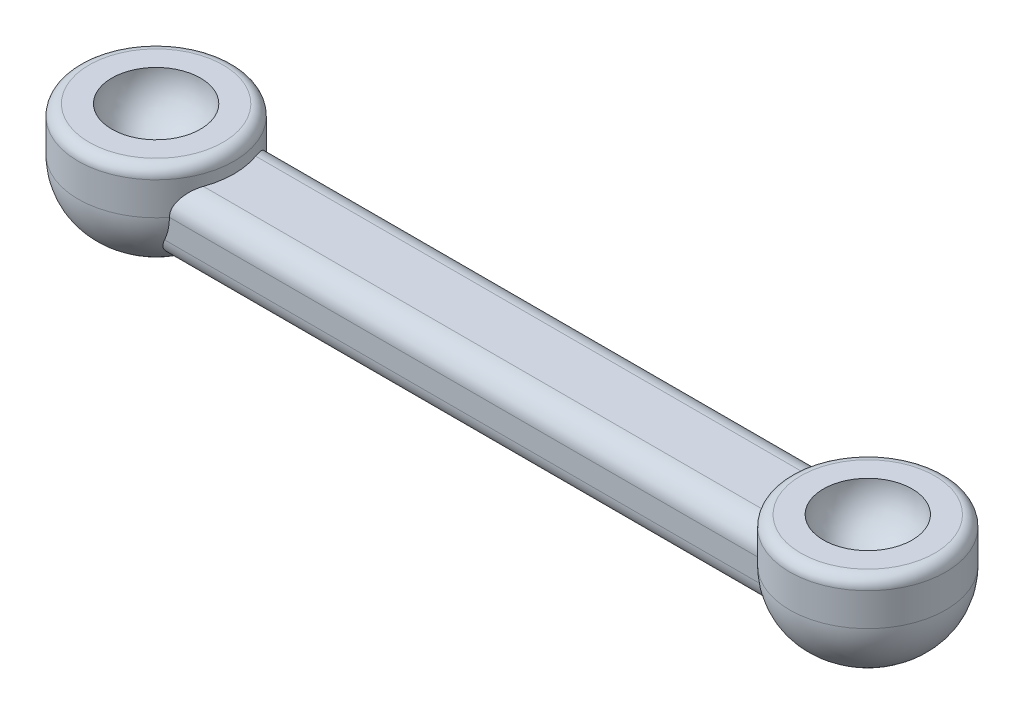
ISO-10303-21;
HEADER;
FILE_DESCRIPTION(('STEP AP214'),'2;1');
FILE_NAME('part.step','',(''),(''),'','','');
FILE_SCHEMA(('AUTOMOTIVE_DESIGN { 1 0 10303 214 1 1 1 1 }'));
ENDSEC;
DATA;
#1=APPLICATION_CONTEXT('core data for automotive mechanical design processes');
#2=APPLICATION_PROTOCOL_DEFINITION('international standard','automotive_design',2000,#1);
#3=PRODUCT_CONTEXT('',#1,'mechanical');
#4=PRODUCT('Part','Part','',(#3));
#5=PRODUCT_RELATED_PRODUCT_CATEGORY('part','',(#4));
#6=PRODUCT_DEFINITION_FORMATION('','',#4);
#7=PRODUCT_DEFINITION_CONTEXT('part definition',#1,'design');
#8=PRODUCT_DEFINITION('design','',#6,#7);
#9=PRODUCT_DEFINITION_SHAPE('','',#8);
#10=(LENGTH_UNIT() NAMED_UNIT(*) SI_UNIT(.MILLI.,.METRE.));
#11=(NAMED_UNIT(*) PLANE_ANGLE_UNIT() SI_UNIT($,.RADIAN.));
#12=(NAMED_UNIT(*) SI_UNIT($,.STERADIAN.) SOLID_ANGLE_UNIT());
#13=UNCERTAINTY_MEASURE_WITH_UNIT(LENGTH_MEASURE(1.E-05),#10,'distance_accuracy_value','');
#14=(GEOMETRIC_REPRESENTATION_CONTEXT(3) GLOBAL_UNCERTAINTY_ASSIGNED_CONTEXT((#13)) GLOBAL_UNIT_ASSIGNED_CONTEXT((#10,
#11,#12)) REPRESENTATION_CONTEXT('',''));
#15=CARTESIAN_POINT('',(0.,0.,0.));
#16=DIRECTION('',(0.,0.,1.));
#17=DIRECTION('',(1.,0.,0.));
#18=AXIS2_PLACEMENT_3D('',#15,#16,#17);
#19=CARTESIAN_POINT('',(-13.4472201299424,-2.5,-2.195));
#20=DIRECTION('',(0.,0.,1.));
#21=DIRECTION('',(1.,0.,0.));
#22=AXIS2_PLACEMENT_3D('',#19,#20,#21);
#23=PLANE('',#22);
#24=DIRECTION('',(1.,0.,0.));
#25=VECTOR('',#24,1.);
#26=CARTESIAN_POINT('',(13.4472201299424,0.5,-2.195));
#27=LINE('',#26,#25);
#28=CARTESIAN_POINT('',(-13.4472201299424,0.5,-2.195));
#29=VERTEX_POINT('',#28);
#30=CARTESIAN_POINT('',(13.4472201299424,0.5,-2.195));
#31=VERTEX_POINT('',#30);
#32=EDGE_CURVE('E201',#29,#31,#27,.T.);
#33=ORIENTED_EDGE('',*,*,#32,.T.);
#34=CARTESIAN_POINT('',(13.4472201299424,0.5,-2.195));
#35=CARTESIAN_POINT('',(13.4472109088285,0.432602571290992,-2.195));
#36=CARTESIAN_POINT('',(13.4501044622695,0.365205684453189,-2.195));
#37=CARTESIAN_POINT('',(13.4616325174703,0.230899808760325,-2.195));
#38=CARTESIAN_POINT('',(13.4702674048736,0.163990852984654,-2.195));
#39=CARTESIAN_POINT('',(13.4930086466798,0.0323427914357527,-2.195));
#40=CARTESIAN_POINT('',(13.5070145486961,-0.0324137261174565,-2.195));
#41=CARTESIAN_POINT('',(13.5403820657083,-0.160521186072004,-2.195));
#42=CARTESIAN_POINT('',(13.5597423232852,-0.223872480329793,-2.195));
#43=CARTESIAN_POINT('',(13.5944608984239,-0.322596513650768,-2.195));
#44=CARTESIAN_POINT('',(13.6081029676669,-0.358582253826507,-2.195));
#45=CARTESIAN_POINT('',(13.6370977765948,-0.429840140287386,-2.195));
#46=CARTESIAN_POINT('',(13.6524497898546,-0.465112582130798,-2.195));
#47=CARTESIAN_POINT('',(13.6686411757147,-0.5,-2.195));
#48=B_SPLINE_CURVE_WITH_KNOTS('',3,(#34,#35,#36,#37,#38,#39,#40,#41,#42,#43,#44,#45,#46,#47),
.UNSPECIFIED.,.F.,.F.,(4,2,2,2,2,2,4),(0.,0.202130089215604,0.404273756811419,0.602807920757318,
0.801291799021977,0.916705926709398,1.03207120939433),.UNSPECIFIED.);
#49=CARTESIAN_POINT('',(13.6686411757147,-0.5,-2.195));
#50=VERTEX_POINT('',#49);
#51=EDGE_CURVE('E237',#31,#50,#48,.T.);
#52=ORIENTED_EDGE('',*,*,#51,.T.);
#53=DIRECTION('',(1.,0.,0.));
#54=VECTOR('',#53,1.);
#55=CARTESIAN_POINT('',(-13.4472201299424,-0.5,-2.195));
#56=LINE('',#55,#54);
#57=CARTESIAN_POINT('',(-13.6686411757147,-0.5,-2.195));
#58=VERTEX_POINT('',#57);
#59=EDGE_CURVE('E151',#50,#58,#56,.F.);
#60=ORIENTED_EDGE('',*,*,#59,.T.);
#61=CARTESIAN_POINT('',(-13.6686411757147,-0.5,-2.195));
#62=CARTESIAN_POINT('',(-13.6402627150046,-0.438874007858253,-2.195));
#63=CARTESIAN_POINT('',(-13.6144689430276,-0.376544824892133,-2.195));
#64=CARTESIAN_POINT('',(-13.5682292635625,-0.249916668861125,-2.195));
#65=CARTESIAN_POINT('',(-13.5477846408031,-0.185617226725221,-2.195));
#66=CARTESIAN_POINT('',(-13.5127536076875,-0.0566855496780724,-2.195));
#67=CARTESIAN_POINT('',(-13.4980683958936,0.00791987348325602,-2.195));
#68=CARTESIAN_POINT('',(-13.4741627060108,0.138119804529283,-2.195));
#69=CARTESIAN_POINT('',(-13.4649404414839,0.20371398187837,-2.195));
#70=CARTESIAN_POINT('',(-13.4547332600442,0.307859075952721,-2.195));
#71=CARTESIAN_POINT('',(-13.4519162204555,0.346239239278498,-2.195));
#72=CARTESIAN_POINT('',(-13.4481598091873,0.423078113863417,-2.195));
#73=CARTESIAN_POINT('',(-13.4472197926063,0.46153679359852,-2.195));
#74=CARTESIAN_POINT('',(-13.4472201299424,0.5,-2.195));
#75=B_SPLINE_CURVE_WITH_KNOTS('',3,(#61,#62,#63,#64,#65,#66,#67,#68,#69,#70,#71,#72,#73,#74),
.UNSPECIFIED.,.F.,.F.,(4,2,2,2,2,2,4),(0.,0.202122617596884,0.404293735406289,0.602826654339475,
0.801294615141169,0.916703405485328,1.03207253722302),.UNSPECIFIED.);
#76=EDGE_CURVE('E199',#58,#29,#75,.T.);
#77=ORIENTED_EDGE('',*,*,#76,.T.);
#78=EDGE_LOOP('',(#33,#52,#60,#77));
#79=FACE_BOUND('',#78,.T.);
#80=ADVANCED_FACE('F138',(#79),#23,.F.);
#81=CARTESIAN_POINT('',(-16.25,-2.5,0.));
#82=DIRECTION('',(0.,1.,0.));
#83=DIRECTION('',(0.,0.,1.));
#84=AXIS2_PLACEMENT_3D('',#81,#82,#83);
#85=PLANE('',#84);
#86=CARTESIAN_POINT('',(16.25,-2.5,0.));
#87=DIRECTION('',(0.,1.,0.));
#88=DIRECTION('',(0.,0.,1.));
#89=AXIS2_PLACEMENT_3D('',#86,#87,#88);
#90=CIRCLE('',#89,0.560000000000001);
#91=CARTESIAN_POINT('',(16.25,-2.5,0.56));
#92=VERTEX_POINT('',#91);
#93=EDGE_CURVE('E234',#92,#92,#90,.F.);
#94=ORIENTED_EDGE('',*,*,#93,.T.);
#95=EDGE_LOOP('',(#94));
#96=FACE_BOUND('',#95,.T.);
#97=ADVANCED_FACE('F337',(#96),#85,.F.);
#98=CARTESIAN_POINT('',(-16.25,2.5,0.));
#99=DIRECTION('',(0.,1.,0.));
#100=DIRECTION('',(0.,0.,1.));
#101=AXIS2_PLACEMENT_3D('',#98,#99,#100);
#102=PLANE('',#101);
#103=CARTESIAN_POINT('',(-16.25,2.5,0.));
#104=DIRECTION('',(0.,1.,0.));
#105=DIRECTION('',(0.,0.,1.));
#106=AXIS2_PLACEMENT_3D('',#103,#104,#105);
#107=CIRCLE('',#106,3.06);
#108=CARTESIAN_POINT('',(-16.25,2.5,3.06));
#109=VERTEX_POINT('',#108);
#110=EDGE_CURVE('E145',#109,#109,#107,.T.);
#111=ORIENTED_EDGE('',*,*,#110,.T.);
#112=EDGE_LOOP('',(#111));
#113=FACE_BOUND('',#112,.T.);
#114=CARTESIAN_POINT('',(-16.25,2.5,0.));
#115=DIRECTION('',(0.,1.,0.));
#116=DIRECTION('',(0.,0.,1.));
#117=AXIS2_PLACEMENT_3D('',#114,#115,#116);
#118=CIRCLE('',#117,2.025);
#119=CARTESIAN_POINT('',(-16.25,2.5,2.025));
#120=VERTEX_POINT('',#119);
#121=EDGE_CURVE('E423',#120,#120,#118,.T.);
#122=ORIENTED_EDGE('',*,*,#121,.F.);
#123=EDGE_LOOP('',(#122));
#124=FACE_BOUND('',#123,.T.);
#125=ADVANCED_FACE('F330',(#113,#124),#102,.T.);
#126=CARTESIAN_POINT('',(16.25,2.5,0.));
#127=DIRECTION('',(0.,1.,0.));
#128=DIRECTION('',(0.,0.,1.));
#129=AXIS2_PLACEMENT_3D('',#126,#127,#128);
#130=CIRCLE('',#129,3.06);
#131=CARTESIAN_POINT('',(16.25,2.5,3.06));
#132=VERTEX_POINT('',#131);
#133=EDGE_CURVE('E210',#132,#132,#130,.T.);
#134=ORIENTED_EDGE('',*,*,#133,.T.);
#135=EDGE_LOOP('',(#134));
#136=FACE_BOUND('',#135,.T.);
#137=CARTESIAN_POINT('',(16.25,2.5,0.));
#138=DIRECTION('',(0.,-1.,0.));
#139=DIRECTION('',(0.,0.,-1.));
#140=AXIS2_PLACEMENT_3D('',#137,#138,#139);
#141=CIRCLE('',#140,2.025);
#142=CARTESIAN_POINT('',(16.25,2.5,-2.025));
#143=VERTEX_POINT('',#142);
#144=EDGE_CURVE('E422',#143,#143,#141,.T.);
#145=ORIENTED_EDGE('',*,*,#144,.T.);
#146=EDGE_LOOP('',(#145));
#147=FACE_BOUND('',#146,.T.);
#148=ADVANCED_FACE('F353',(#136,#147),#102,.T.);
#149=CARTESIAN_POINT('',(-13.4472201299424,-2.5,2.195));
#150=DIRECTION('',(0.,0.,1.));
#151=DIRECTION('',(1.,0.,0.));
#152=AXIS2_PLACEMENT_3D('',#149,#150,#151);
#153=PLANE('',#152);
#154=DIRECTION('',(-1.,0.,0.));
#155=VECTOR('',#154,1.);
#156=CARTESIAN_POINT('',(-13.4472201299424,0.5,2.195));
#157=LINE('',#156,#155);
#158=CARTESIAN_POINT('',(13.4472201299424,0.5,2.195));
#159=VERTEX_POINT('',#158);
#160=CARTESIAN_POINT('',(-13.4472201299424,0.5,2.195));
#161=VERTEX_POINT('',#160);
#162=EDGE_CURVE('E429',#159,#161,#157,.T.);
#163=ORIENTED_EDGE('',*,*,#162,.T.);
#164=CARTESIAN_POINT('',(-13.4472201299424,0.5,2.195));
#165=CARTESIAN_POINT('',(-13.4472109088285,0.432602571290992,2.195));
#166=CARTESIAN_POINT('',(-13.4501044622695,0.365205684453189,2.195));
#167=CARTESIAN_POINT('',(-13.4616325174703,0.230899808760325,2.195));
#168=CARTESIAN_POINT('',(-13.4702674048736,0.163990852984654,2.195));
#169=CARTESIAN_POINT('',(-13.4930086466798,0.0323427914357527,2.195));
#170=CARTESIAN_POINT('',(-13.507014548696,-0.0324137261174564,2.195));
#171=CARTESIAN_POINT('',(-13.5403820657083,-0.160521186072004,2.195));
#172=CARTESIAN_POINT('',(-13.5597423232852,-0.223872480329793,2.195));
#173=CARTESIAN_POINT('',(-13.5944608984239,-0.322596513650767,2.195));
#174=CARTESIAN_POINT('',(-13.6081029676669,-0.358582253826506,2.195));
#175=CARTESIAN_POINT('',(-13.6370977765948,-0.429840140287386,2.195));
#176=CARTESIAN_POINT('',(-13.6524497898546,-0.465112582130799,2.195));
#177=CARTESIAN_POINT('',(-13.6686411757147,-0.5,2.195));
#178=B_SPLINE_CURVE_WITH_KNOTS('',3,(#164,#165,#166,#167,#168,#169,#170,#171,#172,#173,#174,
#175,#176,#177),.UNSPECIFIED.,.F.,.F.,(4,2,2,2,2,2,4),(0.,0.202130089215604,0.404273756811419,
0.602807920757317,0.801291799021977,0.916705926709398,1.03207120939433),.UNSPECIFIED.);
#179=CARTESIAN_POINT('',(-13.6686411757147,-0.5,2.195));
#180=VERTEX_POINT('',#179);
#181=EDGE_CURVE('E231',#161,#180,#178,.T.);
#182=ORIENTED_EDGE('',*,*,#181,.T.);
#183=DIRECTION('',(-1.,0.,0.));
#184=VECTOR('',#183,1.);
#185=CARTESIAN_POINT('',(-13.4472201299424,-0.5,2.195));
#186=LINE('',#185,#184);
#187=CARTESIAN_POINT('',(13.6686411757147,-0.5,2.195));
#188=VERTEX_POINT('',#187);
#189=EDGE_CURVE('E420',#180,#188,#186,.F.);
#190=ORIENTED_EDGE('',*,*,#189,.T.);
#191=CARTESIAN_POINT('',(13.6686411757147,-0.5,2.195));
#192=CARTESIAN_POINT('',(13.6402627150046,-0.438874007858253,2.195));
#193=CARTESIAN_POINT('',(13.6144689430277,-0.376544824892133,2.195));
#194=CARTESIAN_POINT('',(13.5682292635625,-0.249916668861125,2.195));
#195=CARTESIAN_POINT('',(13.5477846408031,-0.185617226725221,2.195));
#196=CARTESIAN_POINT('',(13.5127536076876,-0.0566855496780726,2.195));
#197=CARTESIAN_POINT('',(13.4980683958936,0.00791987348325605,2.195));
#198=CARTESIAN_POINT('',(13.4741627060108,0.138119804529283,2.195));
#199=CARTESIAN_POINT('',(13.4649404414839,0.20371398187837,2.195));
#200=CARTESIAN_POINT('',(13.4547332600442,0.307859075952721,2.195));
#201=CARTESIAN_POINT('',(13.4519162204555,0.346239239278498,2.195));
#202=CARTESIAN_POINT('',(13.4481598091873,0.423078113863417,2.195));
#203=CARTESIAN_POINT('',(13.4472197926063,0.46153679359852,2.195));
#204=CARTESIAN_POINT('',(13.4472201299424,0.5,2.195));
#205=B_SPLINE_CURVE_WITH_KNOTS('',3,(#191,#192,#193,#194,#195,#196,#197,#198,#199,#200,#201,
#202,#203,#204),.UNSPECIFIED.,.F.,.F.,(4,2,2,2,2,2,4),(0.,0.202122617596883,0.404293735406289,
0.602826654339475,0.801294615141169,0.916703405485328,1.03207253722302),.UNSPECIFIED.);
#206=EDGE_CURVE('E285',#188,#159,#205,.T.);
#207=ORIENTED_EDGE('',*,*,#206,.T.);
#208=EDGE_LOOP('',(#163,#182,#190,#207));
#209=FACE_BOUND('',#208,.T.);
#210=ADVANCED_FACE('F354',(#209),#153,.T.);
#211=CARTESIAN_POINT('',(-16.25,-2.5,0.));
#212=DIRECTION('',(0.,1.,0.));
#213=DIRECTION('',(0.,0.,1.));
#214=AXIS2_PLACEMENT_3D('',#211,#212,#213);
#215=CIRCLE('',#214,0.560000000000001);
#216=CARTESIAN_POINT('',(-16.25,-2.5,0.56));
#217=VERTEX_POINT('',#216);
#218=EDGE_CURVE('E232',#217,#217,#215,.F.);
#219=ORIENTED_EDGE('',*,*,#218,.T.);
#220=EDGE_LOOP('',(#219));
#221=FACE_BOUND('',#220,.T.);
#222=ADVANCED_FACE('F347',(#221),#85,.F.);
#223=CARTESIAN_POINT('',(-16.25,-2.5,0.));
#224=DIRECTION('',(0.,1.,0.));
#225=DIRECTION('',(0.,0.,1.));
#226=AXIS2_PLACEMENT_3D('',#223,#224,#225);
#227=CYLINDRICAL_SURFACE('',#226,3.56);
#228=CARTESIAN_POINT('',(-16.25,2.,0.));
#229=DIRECTION('',(0.,1.,0.));
#230=DIRECTION('',(0.,0.,1.));
#231=AXIS2_PLACEMENT_3D('',#228,#229,#230);
#232=CIRCLE('',#231,3.56);
#233=CARTESIAN_POINT('',(-16.25,2.,3.56));
#234=VERTEX_POINT('',#233);
#235=EDGE_CURVE('E12',#234,#234,#232,.F.);
#236=ORIENTED_EDGE('',*,*,#235,.T.);
#237=EDGE_LOOP('',(#236));
#238=FACE_BOUND('',#237,.T.);
#239=CARTESIAN_POINT('',(-12.896557738681,1.5,-1.195));
#240=CARTESIAN_POINT('',(-12.9074346542415,1.49999950941808,-1.22553072034822));
#241=CARTESIAN_POINT('',(-12.9187263641215,1.49860151338854,-1.25589032884327));
#242=CARTESIAN_POINT('',(-12.9420372344106,1.49310460527387,-1.31606223859236));
#243=CARTESIAN_POINT('',(-12.9540559744853,1.48900724053446,-1.34587484334551));
#244=CARTESIAN_POINT('',(-12.9909633015934,1.47285094316962,-1.43398440792859));
#245=CARTESIAN_POINT('',(-13.0167979474529,1.4569261082306,-1.49121816340405));
#246=CARTESIAN_POINT('',(-13.0698569116429,1.41564653466997,-1.601257232311));
#247=CARTESIAN_POINT('',(-13.0970783312673,1.3903108214201,-1.65407121874427));
#248=CARTESIAN_POINT('',(-13.1518377423066,1.33088500393187,-1.75449882602895));
#249=CARTESIAN_POINT('',(-13.1793762158462,1.29677920433151,-1.80210290294257));
#250=CARTESIAN_POINT('',(-13.2349417161804,1.21811958333565,-1.89368975562047));
#251=CARTESIAN_POINT('',(-13.2628991059993,1.17306208697599,-1.93728450306326));
#252=CARTESIAN_POINT('',(-13.3154490133736,1.07439502939019,-2.01599755248653));
#253=CARTESIAN_POINT('',(-13.3400470105599,1.02079971159229,-2.05112973135048));
#254=CARTESIAN_POINT('',(-13.3773637259949,0.921765507033029,-2.10292365431881));
#255=CARTESIAN_POINT('',(-13.3914903711954,0.878119133771127,-2.12200857842532));
#256=CARTESIAN_POINT('',(-13.415486210934,0.787562991185918,-2.15395731867621));
#257=CARTESIAN_POINT('',(-13.4253666216609,0.740662204069532,-2.16683753523627));
#258=CARTESIAN_POINT('',(-13.4374128602263,0.661255859508831,-2.18243361438047));
#259=CARTESIAN_POINT('',(-13.4410633599846,0.629349637277794,-2.18712191192799));
#260=CARTESIAN_POINT('',(-13.4459790619245,0.564972866404527,-2.19341540311096));
#261=CARTESIAN_POINT('',(-13.4472381523263,0.532501085275851,-2.19501269719353));
#262=CARTESIAN_POINT('',(-13.4472201299424,0.5,-2.195));
#263=B_SPLINE_CURVE_WITH_KNOTS('',3,(#239,#240,#241,#242,#243,#244,#245,#246,#247,#248,#249,
#250,#251,#252,#253,#254,#255,#256,#257,#258,#259,#260,#261,#262),.UNSPECIFIED.,.F.,.F.,(4,2,2,
2,2,2,2,2,2,2,2,4),(0.,0.097158370322828,0.194261095437949,0.38763324105755,0.58061656756699,
0.773947699477361,0.978865761162459,1.18344547601125,1.33193513078686,1.48003011109943,
1.57717012301435,1.67455806557198),.UNSPECIFIED.);
#264=CARTESIAN_POINT('',(-12.896557738681,1.5,-1.195));
#265=VERTEX_POINT('',#264);
#266=EDGE_CURVE('E212',#265,#29,#263,.T.);
#267=ORIENTED_EDGE('',*,*,#266,.T.);
#268=CARTESIAN_POINT('',(-16.25,0.5,0.));
#269=DIRECTION('',(0.,1.,0.));
#270=DIRECTION('',(0.,0.,1.));
#271=AXIS2_PLACEMENT_3D('',#268,#269,#270);
#272=CIRCLE('',#271,3.56);
#273=EDGE_CURVE('E216',#29,#161,#272,.T.);
#274=ORIENTED_EDGE('',*,*,#273,.T.);
#275=CARTESIAN_POINT('',(-13.4472201299424,0.5,2.195));
#276=CARTESIAN_POINT('',(-13.4472245969085,0.524509549238603,2.19500270451756));
#277=CARTESIAN_POINT('',(-13.446513737018,0.549004327345687,2.194098252884));
#278=CARTESIAN_POINT('',(-13.4437075057277,0.597764908156984,2.19050917538381));
#279=CARTESIAN_POINT('',(-13.4416131939368,0.622030871698162,2.18782591193315));
#280=CARTESIAN_POINT('',(-13.4333683634499,0.693843816979084,2.17721593284655));
#281=CARTESIAN_POINT('',(-13.4252543290541,0.74081816743921,2.16672772506439));
#282=CARTESIAN_POINT('',(-13.4046342491631,0.831708518509401,2.13957422647419));
#283=CARTESIAN_POINT('',(-13.3921401974189,0.875632482366391,2.12292579729141));
#284=CARTESIAN_POINT('',(-13.3637635655598,0.959902212393859,2.08418228519336));
#285=CARTESIAN_POINT('',(-13.3478746257607,1.00024105887482,2.06207696757945));
#286=CARTESIAN_POINT('',(-13.311958846111,1.08075462330921,2.01062039465393));
#287=CARTESIAN_POINT('',(-13.2916744460513,1.12048524133522,1.98075756485626));
#288=CARTESIAN_POINT('',(-13.249370142156,1.19461032895016,1.9160681198075));
#289=CARTESIAN_POINT('',(-13.2273494037573,1.22900220863128,1.88123911100356));
#290=CARTESIAN_POINT('',(-13.1782090791776,1.29826116172824,1.80009895063681));
#291=CARTESIAN_POINT('',(-13.1509249746979,1.33194148756405,1.75286869351119));
#292=CARTESIAN_POINT('',(-13.0966432197969,1.39071546105762,1.65322826861462));
#293=CARTESIAN_POINT('',(-13.0696455023893,1.41581116158465,1.60081934310445));
#294=CARTESIAN_POINT('',(-13.0167813857364,1.45693883991755,1.4911832575041));
#295=CARTESIAN_POINT('',(-12.9909301197713,1.47287131559559,1.43391067857103));
#296=CARTESIAN_POINT('',(-12.9540170946714,1.48902131642236,1.34577925186265));
#297=CARTESIAN_POINT('',(-12.9420066346575,1.49311349189506,1.31598488271389));
#298=CARTESIAN_POINT('',(-12.9187117230374,1.49860329246021,1.25585089694945));
#299=CARTESIAN_POINT('',(-12.9074276757887,1.49999942912859,1.22551098847636));
#300=CARTESIAN_POINT('',(-12.896557738681,1.5,1.195));
#301=B_SPLINE_CURVE_WITH_KNOTS('',3,(#275,#276,#277,#278,#279,#280,#281,#282,#283,#284,#285,
#286,#287,#288,#289,#290,#291,#292,#293,#294,#295,#296,#297,#298,#299,#300),.UNSPECIFIED.,.F.,
.F.,(4,2,2,2,2,2,2,2,2,2,2,2,4),(0.,0.073473787371381,0.146891365094138,0.292508282182236,
0.437729533211777,0.583225252215567,0.743693973361312,0.904240298812615,1.09573939684897,
1.28719266902024,1.48068745295021,1.5777291297799,1.67482436589811),.UNSPECIFIED.);
#302=CARTESIAN_POINT('',(-12.896557738681,1.5,1.195));
#303=VERTEX_POINT('',#302);
#304=EDGE_CURVE('E225',#161,#303,#301,.T.);
#305=ORIENTED_EDGE('',*,*,#304,.T.);
#306=CARTESIAN_POINT('',(-16.25,1.5,0.));
#307=DIRECTION('',(0.,1.,0.));
#308=DIRECTION('',(0.,0.,-1.));
#309=AXIS2_PLACEMENT_3D('',#306,#307,#308);
#310=CIRCLE('',#309,3.56);
#311=EDGE_CURVE('E218',#303,#265,#310,.T.);
#312=ORIENTED_EDGE('',*,*,#311,.T.);
#313=EDGE_LOOP('',(#267,#274,#305,#312));
#314=FACE_BOUND('',#313,.T.);
#315=ADVANCED_FACE('F214',(#238,#314),#227,.T.);
#316=CARTESIAN_POINT('',(16.25,-2.5,0.));
#317=DIRECTION('',(0.,1.,0.));
#318=DIRECTION('',(0.,0.,1.));
#319=AXIS2_PLACEMENT_3D('',#316,#317,#318);
#320=CYLINDRICAL_SURFACE('',#319,3.56);
#321=CARTESIAN_POINT('',(16.25,2.,0.));
#322=DIRECTION('',(0.,1.,0.));
#323=DIRECTION('',(0.,0.,1.));
#324=AXIS2_PLACEMENT_3D('',#321,#322,#323);
#325=CIRCLE('',#324,3.56);
#326=CARTESIAN_POINT('',(16.25,2.,3.56));
#327=VERTEX_POINT('',#326);
#328=EDGE_CURVE('E325',#327,#327,#325,.F.);
#329=ORIENTED_EDGE('',*,*,#328,.T.);
#330=EDGE_LOOP('',(#329));
#331=FACE_BOUND('',#330,.T.);
#332=CARTESIAN_POINT('',(12.896557738681,1.5,1.195));
#333=CARTESIAN_POINT('',(12.9074346542415,1.49999950941808,1.22553072034822));
#334=CARTESIAN_POINT('',(12.9187263641215,1.49860151338854,1.25589032884327));
#335=CARTESIAN_POINT('',(12.9420372344106,1.49310460527387,1.31606223859236));
#336=CARTESIAN_POINT('',(12.9540559744853,1.48900724053446,1.34587484334551));
#337=CARTESIAN_POINT('',(12.9909633015934,1.47285094316962,1.43398440792858));
#338=CARTESIAN_POINT('',(13.016797947453,1.4569261082306,1.49121816340405));
#339=CARTESIAN_POINT('',(13.0698569116429,1.41564653466997,1.60125723231099));
#340=CARTESIAN_POINT('',(13.0970783312674,1.3903108214201,1.65407121874427));
#341=CARTESIAN_POINT('',(13.1518377423066,1.33088500393187,1.75449882602895));
#342=CARTESIAN_POINT('',(13.1793762158463,1.29677920433151,1.80210290294257));
#343=CARTESIAN_POINT('',(13.2349417161804,1.21811958333565,1.89368975562047));
#344=CARTESIAN_POINT('',(13.2628991059993,1.17306208697599,1.93728450306326));
#345=CARTESIAN_POINT('',(13.3154490133736,1.07439502939019,2.01599755248653));
#346=CARTESIAN_POINT('',(13.3400470105599,1.02079971159229,2.05112973135048));
#347=CARTESIAN_POINT('',(13.3773637259949,0.921765507033028,2.1029236543188));
#348=CARTESIAN_POINT('',(13.3914903711954,0.878119133771127,2.12200857842532));
#349=CARTESIAN_POINT('',(13.4154862109341,0.787562991185918,2.1539573186762));
#350=CARTESIAN_POINT('',(13.4253666216609,0.740662204069532,2.16683753523627));
#351=CARTESIAN_POINT('',(13.4374128602263,0.661255859508831,2.18243361438047));
#352=CARTESIAN_POINT('',(13.4410633599846,0.629349637277793,2.18712191192799));
#353=CARTESIAN_POINT('',(13.4459790619245,0.564972866404527,2.19341540311096));
#354=CARTESIAN_POINT('',(13.4472381523263,0.532501085275851,2.19501269719353));
#355=CARTESIAN_POINT('',(13.4472201299424,0.500000000000001,2.195));
#356=B_SPLINE_CURVE_WITH_KNOTS('',3,(#332,#333,#334,#335,#336,#337,#338,#339,#340,#341,#342,
#343,#344,#345,#346,#347,#348,#349,#350,#351,#352,#353,#354,#355),.UNSPECIFIED.,.F.,.F.,(4,2,2,
2,2,2,2,2,2,2,2,4),(0.,0.0971583703228284,0.194261095437949,0.387633241057551,0.580616567566991,
0.773947699477363,0.978865761162461,1.18344547601125,1.33193513078686,1.48003011109944,
1.57717012301435,1.67455806557198),.UNSPECIFIED.);
#357=CARTESIAN_POINT('',(12.896557738681,1.5,1.195));
#358=VERTEX_POINT('',#357);
#359=EDGE_CURVE('E380',#358,#159,#356,.T.);
#360=ORIENTED_EDGE('',*,*,#359,.T.);
#361=CARTESIAN_POINT('',(16.25,0.5,0.));
#362=DIRECTION('',(0.,1.,0.));
#363=DIRECTION('',(0.,0.,1.));
#364=AXIS2_PLACEMENT_3D('',#361,#362,#363);
#365=CIRCLE('',#364,3.56);
#366=EDGE_CURVE('E239',#159,#31,#365,.T.);
#367=ORIENTED_EDGE('',*,*,#366,.T.);
#368=CARTESIAN_POINT('',(13.4472201299424,0.5,-2.195));
#369=CARTESIAN_POINT('',(13.4472245969085,0.524509549238603,-2.19500270451756));
#370=CARTESIAN_POINT('',(13.446513737018,0.549004327345687,-2.194098252884));
#371=CARTESIAN_POINT('',(13.4437075057277,0.597764908156984,-2.19050917538381));
#372=CARTESIAN_POINT('',(13.4416131939368,0.622030871698162,-2.18782591193315));
#373=CARTESIAN_POINT('',(13.4333683634499,0.693843816979084,-2.17721593284656));
#374=CARTESIAN_POINT('',(13.4252543290541,0.74081816743921,-2.16672772506439));
#375=CARTESIAN_POINT('',(13.4046342491631,0.831708518509401,-2.13957422647419));
#376=CARTESIAN_POINT('',(13.3921401974189,0.875632482366391,-2.12292579729141));
#377=CARTESIAN_POINT('',(13.3637635655598,0.95990221239386,-2.08418228519337));
#378=CARTESIAN_POINT('',(13.3478746257607,1.00024105887482,-2.06207696757945));
#379=CARTESIAN_POINT('',(13.311958846111,1.08075462330921,-2.01062039465393));
#380=CARTESIAN_POINT('',(13.2916744460513,1.12048524133522,-1.98075756485626));
#381=CARTESIAN_POINT('',(13.2493701421561,1.19461032895016,-1.9160681198075));
#382=CARTESIAN_POINT('',(13.2273494037573,1.22900220863128,-1.88123911100356));
#383=CARTESIAN_POINT('',(13.1782090791776,1.29826116172824,-1.80009895063681));
#384=CARTESIAN_POINT('',(13.1509249746979,1.33194148756405,-1.75286869351119));
#385=CARTESIAN_POINT('',(13.0966432197969,1.39071546105762,-1.65322826861462));
#386=CARTESIAN_POINT('',(13.0696455023893,1.41581116158465,-1.60081934310445));
#387=CARTESIAN_POINT('',(13.0167813857364,1.45693883991755,-1.4911832575041));
#388=CARTESIAN_POINT('',(12.9909301197713,1.47287131559559,-1.43391067857103));
#389=CARTESIAN_POINT('',(12.9540170946714,1.48902131642236,-1.34577925186265));
#390=CARTESIAN_POINT('',(12.9420066346575,1.49311349189506,-1.31598488271389));
#391=CARTESIAN_POINT('',(12.9187117230374,1.49860329246021,-1.25585089694945));
#392=CARTESIAN_POINT('',(12.9074276757887,1.49999942912859,-1.22551098847636));
#393=CARTESIAN_POINT('',(12.896557738681,1.5,-1.195));
#394=B_SPLINE_CURVE_WITH_KNOTS('',3,(#368,#369,#370,#371,#372,#373,#374,#375,#376,#377,#378,
#379,#380,#381,#382,#383,#384,#385,#386,#387,#388,#389,#390,#391,#392,#393),.UNSPECIFIED.,.F.,
.F.,(4,2,2,2,2,2,2,2,2,2,2,2,4),(0.,0.0734737873713809,0.146891365094138,0.292508282182236,
0.437729533211777,0.583225252215567,0.743693973361312,0.904240298812616,1.09573939684896,
1.28719266902024,1.48068745295021,1.5777291297799,1.67482436589811),.UNSPECIFIED.);
#395=CARTESIAN_POINT('',(12.896557738681,1.5,-1.195));
#396=VERTEX_POINT('',#395);
#397=EDGE_CURVE('E224',#31,#396,#394,.T.);
#398=ORIENTED_EDGE('',*,*,#397,.T.);
#399=CARTESIAN_POINT('',(16.25,1.5,0.));
#400=DIRECTION('',(0.,1.,0.));
#401=DIRECTION('',(0.,0.,1.));
#402=AXIS2_PLACEMENT_3D('',#399,#400,#401);
#403=CIRCLE('',#402,3.56);
#404=EDGE_CURVE('E440',#396,#358,#403,.T.);
#405=ORIENTED_EDGE('',*,*,#404,.T.);
#406=EDGE_LOOP('',(#360,#367,#398,#405));
#407=FACE_BOUND('',#406,.T.);
#408=ADVANCED_FACE('F357',(#331,#407),#320,.T.);
#409=CARTESIAN_POINT('',(-16.25,2.5,0.));
#410=DIRECTION('',(0.,1.,0.));
#411=DIRECTION('',(-1.,0.,0.));
#412=AXIS2_PLACEMENT_3D('',#409,#410,#411);
#413=SPHERICAL_SURFACE('',#412,2.025);
#414=ORIENTED_EDGE('',*,*,#121,.T.);
#415=EDGE_LOOP('',(#414));
#416=FACE_BOUND('',#415,.T.);
#417=ADVANCED_FACE('F359',(#416),#413,.F.);
#418=CARTESIAN_POINT('',(16.25,2.5,0.));
#419=DIRECTION('',(0.,-1.,0.));
#420=DIRECTION('',(1.,0.,0.));
#421=AXIS2_PLACEMENT_3D('',#418,#419,#420);
#422=SPHERICAL_SURFACE('',#421,2.025);
#423=ORIENTED_EDGE('',*,*,#144,.F.);
#424=EDGE_LOOP('',(#423));
#425=FACE_BOUND('',#424,.T.);
#426=ADVANCED_FACE('F368',(#425),#422,.F.);
#427=CARTESIAN_POINT('',(16.25,1.5,0.));
#428=DIRECTION('',(0.,1.,0.));
#429=DIRECTION('',(1.,0.,0.));
#430=AXIS2_PLACEMENT_3D('',#427,#428,#429);
#431=PLANE('',#430);
#432=ORIENTED_EDGE('',*,*,#404,.F.);
#433=DIRECTION('',(1.,0.,0.));
#434=VECTOR('',#433,1.);
#435=CARTESIAN_POINT('',(-13.4472201299424,1.5,-1.195));
#436=LINE('',#435,#434);
#437=EDGE_CURVE('E386',#396,#265,#436,.F.);
#438=ORIENTED_EDGE('',*,*,#437,.T.);
#439=ORIENTED_EDGE('',*,*,#311,.F.);
#440=DIRECTION('',(-1.,0.,0.));
#441=VECTOR('',#440,1.);
#442=CARTESIAN_POINT('',(16.25,1.5,1.195));
#443=LINE('',#442,#441);
#444=EDGE_CURVE('E433',#303,#358,#443,.F.);
#445=ORIENTED_EDGE('',*,*,#444,.T.);
#446=EDGE_LOOP('',(#432,#438,#439,#445));
#447=FACE_BOUND('',#446,.T.);
#448=ADVANCED_FACE('F436',(#447),#431,.T.);
#449=CARTESIAN_POINT('',(0.,-1.5,0.));
#450=DIRECTION('',(0.,-1.,0.));
#451=DIRECTION('',(0.,0.,-1.));
#452=AXIS2_PLACEMENT_3D('',#449,#450,#451);
#453=PLANE('',#452);
#454=DIRECTION('',(-1.,0.,0.));
#455=VECTOR('',#454,1.);
#456=CARTESIAN_POINT('',(0.,-1.5,1.195));
#457=LINE('',#456,#455);
#458=CARTESIAN_POINT('',(13.7221607775019,-1.5,1.195));
#459=VERTEX_POINT('',#458);
#460=CARTESIAN_POINT('',(-13.7221607775019,-1.5,1.195));
#461=VERTEX_POINT('',#460);
#462=EDGE_CURVE('E416',#459,#461,#457,.T.);
#463=ORIENTED_EDGE('',*,*,#462,.T.);
#464=CARTESIAN_POINT('',(-16.25,-1.5,0.));
#465=DIRECTION('',(0.,1.,0.));
#466=DIRECTION('',(0.,0.,1.));
#467=AXIS2_PLACEMENT_3D('',#464,#465,#466);
#468=CIRCLE('',#467,2.79606797749979);
#469=CARTESIAN_POINT('',(-13.7221607775019,-1.5,-1.195));
#470=VERTEX_POINT('',#469);
#471=EDGE_CURVE('E301',#461,#470,#468,.T.);
#472=ORIENTED_EDGE('',*,*,#471,.T.);
#473=DIRECTION('',(1.,0.,0.));
#474=VECTOR('',#473,1.);
#475=CARTESIAN_POINT('',(13.4472201299424,-1.5,-1.195));
#476=LINE('',#475,#474);
#477=CARTESIAN_POINT('',(13.7221607775019,-1.5,-1.195));
#478=VERTEX_POINT('',#477);
#479=EDGE_CURVE('E158',#470,#478,#476,.T.);
#480=ORIENTED_EDGE('',*,*,#479,.T.);
#481=CARTESIAN_POINT('',(16.25,-1.5,0.));
#482=DIRECTION('',(0.,1.,0.));
#483=DIRECTION('',(0.,0.,1.));
#484=AXIS2_PLACEMENT_3D('',#481,#482,#483);
#485=CIRCLE('',#484,2.79606797749979);
#486=EDGE_CURVE('E281',#478,#459,#485,.T.);
#487=ORIENTED_EDGE('',*,*,#486,.T.);
#488=EDGE_LOOP('',(#463,#472,#480,#487));
#489=FACE_BOUND('',#488,.T.);
#490=ADVANCED_FACE('F417',(#489),#453,.T.);
#491=CARTESIAN_POINT('',(0.,-0.5,-1.195));
#492=DIRECTION('',(-1.,0.,0.));
#493=DIRECTION('',(0.,0.,1.));
#494=AXIS2_PLACEMENT_3D('',#491,#492,#493);
#495=CYLINDRICAL_SURFACE('',#494,1.);
#496=ORIENTED_EDGE('',*,*,#479,.F.);
#497=CARTESIAN_POINT('',(-13.7221607775019,-1.5,-1.195));
#498=CARTESIAN_POINT('',(-13.7447661529897,-1.50002910469057,-1.24276404600964));
#499=CARTESIAN_POINT('',(-13.7659766865336,-1.49657489084662,-1.29134202996736));
#500=CARTESIAN_POINT('',(-13.8047027378317,-1.48220654769887,-1.38921597863558));
#501=CARTESIAN_POINT('',(-13.8221933579676,-1.47124410500578,-1.43851455744911));
#502=CARTESIAN_POINT('',(-13.8523346996845,-1.44127291910722,-1.53653132538474));
#503=CARTESIAN_POINT('',(-13.8649587602018,-1.42222102097426,-1.58524493940671));
#504=CARTESIAN_POINT('',(-13.8842877523795,-1.37616725611775,-1.67985486783024));
#505=CARTESIAN_POINT('',(-13.891012507146,-1.34919242348516,-1.72576013140652));
#506=CARTESIAN_POINT('',(-13.8978127350182,-1.29125497620672,-1.80833935583686));
#507=CARTESIAN_POINT('',(-13.8985195849997,-1.26102208728597,-1.84547583317687));
#508=CARTESIAN_POINT('',(-13.8950633312779,-1.19566707397369,-1.91494625057112));
#509=CARTESIAN_POINT('',(-13.8908966934065,-1.16054141771354,-1.94727668619491));
#510=CARTESIAN_POINT('',(-13.8783939807266,-1.08790785586342,-2.0052139899263));
#511=CARTESIAN_POINT('',(-13.8702136898364,-1.05053154654861,-2.03102128561424));
#512=CARTESIAN_POINT('',(-13.8503652160353,-0.973350567391738,-2.07701987140838));
#513=CARTESIAN_POINT('',(-13.8386964728823,-0.933545508312705,-2.09721025843827));
#514=CARTESIAN_POINT('',(-13.8111968245698,-0.848384970498554,-2.13360590328832));
#515=CARTESIAN_POINT('',(-13.7950669394763,-0.802871781754381,-2.14921314623658));
#516=CARTESIAN_POINT('',(-13.7601482182387,-0.711086977066486,-2.17362062680184));
#517=CARTESIAN_POINT('',(-13.7413594849113,-0.664815390510905,-2.18242112754827));
#518=CARTESIAN_POINT('',(-13.7045945398609,-0.578937856166083,-2.19268023360632));
#519=CARTESIAN_POINT('',(-13.6868836587639,-0.539321063340742,-2.19500591329666));
#520=CARTESIAN_POINT('',(-13.6686411757147,-0.5,-2.195));
#521=B_SPLINE_CURVE_WITH_KNOTS('',3,(#497,#498,#499,#500,#501,#502,#503,#504,#505,#506,#507,
#508,#509,#510,#511,#512,#513,#514,#515,#516,#517,#518,#519,#520),.UNSPECIFIED.,.F.,.F.,(4,2,2,
2,2,2,2,2,2,2,2,4),(0.,0.158605502241527,0.318241295974231,0.478739617725698,0.638696537094982,
0.781633304965198,0.924673792381185,1.06255572638156,1.20045981599227,1.35211299886087,
1.5037603189523,1.63381171490749),.UNSPECIFIED.);
#522=EDGE_CURVE('E208',#470,#58,#521,.T.);
#523=ORIENTED_EDGE('',*,*,#522,.T.);
#524=ORIENTED_EDGE('',*,*,#59,.F.);
#525=CARTESIAN_POINT('',(13.6686411757147,-0.5,-2.195));
#526=CARTESIAN_POINT('',(13.6933609410987,-0.553300086414205,-2.19502216172703));
#527=CARTESIAN_POINT('',(13.7171286816578,-0.607174788323763,-2.19073539566947));
#528=CARTESIAN_POINT('',(13.7618599900167,-0.715116533051574,-2.17312588380305));
#529=CARTESIAN_POINT('',(13.7827991807217,-0.769181576894085,-2.15972993578822));
#530=CARTESIAN_POINT('',(13.820619291805,-0.875870605946225,-2.12339122676375));
#531=CARTESIAN_POINT('',(13.8374818014027,-0.928487136419782,-2.10040638802917));
#532=CARTESIAN_POINT('',(13.8656009312922,-1.02995194858548,-2.04498377437138));
#533=CARTESIAN_POINT('',(13.8768773247173,-1.07881299688305,-2.01257999557583));
#534=CARTESIAN_POINT('',(13.8916425921634,-1.16513094976714,-1.94351520628498));
#535=CARTESIAN_POINT('',(13.8959124790149,-1.20325203524261,-1.90785291656697));
#536=CARTESIAN_POINT('',(13.8985869368686,-1.27354660164609,-1.83087455388757));
#537=CARTESIAN_POINT('',(13.8969933502218,-1.30572194743727,-1.78956026075935));
#538=CARTESIAN_POINT('',(13.8883971842804,-1.3596546549153,-1.70793940947116));
#539=CARTESIAN_POINT('',(13.8820427597906,-1.38218717685746,-1.66807079384736));
#540=CARTESIAN_POINT('',(13.8650091368202,-1.42133396689967,-1.58640100104376));
#541=CARTESIAN_POINT('',(13.8543286211396,-1.43794642957285,-1.54459923870012));
#542=CARTESIAN_POINT('',(13.8288397492606,-1.46560848307854,-1.45898086601564));
#543=CARTESIAN_POINT('',(13.813919327404,-1.47648028038186,-1.41514114319983));
#544=CARTESIAN_POINT('',(13.7808449712685,-1.49215636427138,-1.32766158094326));
#545=CARTESIAN_POINT('',(13.7626937633577,-1.49696573931984,-1.28402160454578));
#546=CARTESIAN_POINT('',(13.7364047520052,-1.49965319689712,-1.2255014465462));
#547=CARTESIAN_POINT('',(13.7293528203307,-1.50000077025937,-1.21021246912889));
#548=CARTESIAN_POINT('',(13.7221607775019,-1.50000000000001,-1.195));
#549=B_SPLINE_CURVE_WITH_KNOTS('',3,(#525,#526,#527,#528,#529,#530,#531,#532,#533,#534,#535,
#536,#537,#538,#539,#540,#541,#542,#543,#544,#545,#546,#547,#548),.UNSPECIFIED.,.F.,.F.,(4,2,2,
2,2,2,2,2,2,2,2,4),(0.,0.176280312091003,0.353994235947993,0.532496341739795,0.71036200788402,
0.866571363984364,1.02273164202661,1.1607971000204,1.2989046275592,1.44107010772533,
1.58311618241506,1.63361507263584),.UNSPECIFIED.);
#550=EDGE_CURVE('E246',#50,#478,#549,.T.);
#551=ORIENTED_EDGE('',*,*,#550,.T.);
#552=EDGE_LOOP('',(#496,#523,#524,#551));
#553=FACE_BOUND('',#552,.T.);
#554=ADVANCED_FACE('F295',(#553),#495,.T.);
#555=CARTESIAN_POINT('',(0.,-0.5,1.195));
#556=DIRECTION('',(-1.,0.,0.));
#557=DIRECTION('',(0.,0.,1.));
#558=AXIS2_PLACEMENT_3D('',#555,#556,#557);
#559=CYLINDRICAL_SURFACE('',#558,1.);
#560=ORIENTED_EDGE('',*,*,#462,.F.);
#561=CARTESIAN_POINT('',(13.7221607775019,-1.5,1.195));
#562=CARTESIAN_POINT('',(13.7447661529897,-1.50002910469057,1.24276404600964));
#563=CARTESIAN_POINT('',(13.7659766865336,-1.49657489084662,1.29134202996736));
#564=CARTESIAN_POINT('',(13.8047027378317,-1.48220654769887,1.38921597863558));
#565=CARTESIAN_POINT('',(13.8221933579676,-1.47124410500578,1.43851455744911));
#566=CARTESIAN_POINT('',(13.8523346996845,-1.44127291910722,1.53653132538474));
#567=CARTESIAN_POINT('',(13.8649587602018,-1.42222102097426,1.58524493940671));
#568=CARTESIAN_POINT('',(13.8842877523795,-1.37616725611775,1.67985486783024));
#569=CARTESIAN_POINT('',(13.891012507146,-1.34919242348516,1.72576013140652));
#570=CARTESIAN_POINT('',(13.8978127350182,-1.29125497620672,1.80833935583686));
#571=CARTESIAN_POINT('',(13.8985195849997,-1.26102208728597,1.84547583317687));
#572=CARTESIAN_POINT('',(13.8950633312779,-1.19566707397369,1.91494625057112));
#573=CARTESIAN_POINT('',(13.8908966934065,-1.16054141771354,1.94727668619491));
#574=CARTESIAN_POINT('',(13.8783939807266,-1.08790785586342,2.0052139899263));
#575=CARTESIAN_POINT('',(13.8702136898364,-1.05053154654861,2.03102128561424));
#576=CARTESIAN_POINT('',(13.8503652160353,-0.973350567391737,2.07701987140838));
#577=CARTESIAN_POINT('',(13.8386964728823,-0.933545508312704,2.09721025843827));
#578=CARTESIAN_POINT('',(13.8111968245698,-0.848384970498552,2.13360590328832));
#579=CARTESIAN_POINT('',(13.7950669394763,-0.802871781754379,2.14921314623658));
#580=CARTESIAN_POINT('',(13.7601482182387,-0.711086977066483,2.17362062680184));
#581=CARTESIAN_POINT('',(13.7413594849113,-0.664815390510903,2.18242112754827));
#582=CARTESIAN_POINT('',(13.704594539861,-0.578937856166082,2.19268023360632));
#583=CARTESIAN_POINT('',(13.6868836587639,-0.539321063340741,2.19500591329665));
#584=CARTESIAN_POINT('',(13.6686411757147,-0.5,2.195));
#585=B_SPLINE_CURVE_WITH_KNOTS('',3,(#561,#562,#563,#564,#565,#566,#567,#568,#569,#570,#571,
#572,#573,#574,#575,#576,#577,#578,#579,#580,#581,#582,#583,#584),.UNSPECIFIED.,.F.,.F.,(4,2,2,
2,2,2,2,2,2,2,2,4),(0.,0.158605502241527,0.318241295974232,0.478739617725699,0.638696537094983,
0.7816333049652,0.924673792381187,1.06255572638156,1.20045981599228,1.35211299886087,
1.5037603189523,1.63381171490749),.UNSPECIFIED.);
#586=EDGE_CURVE('E274',#459,#188,#585,.T.);
#587=ORIENTED_EDGE('',*,*,#586,.T.);
#588=ORIENTED_EDGE('',*,*,#189,.F.);
#589=CARTESIAN_POINT('',(-13.6686411757147,-0.5,2.195));
#590=CARTESIAN_POINT('',(-13.6933609410987,-0.553300086414205,2.19502216172703));
#591=CARTESIAN_POINT('',(-13.7171286816578,-0.607174788323762,2.19073539566947));
#592=CARTESIAN_POINT('',(-13.7618599900167,-0.715116533051573,2.17312588380305));
#593=CARTESIAN_POINT('',(-13.7827991807217,-0.769181576894084,2.15972993578822));
#594=CARTESIAN_POINT('',(-13.820619291805,-0.875870605946225,2.12339122676375));
#595=CARTESIAN_POINT('',(-13.8374818014027,-0.928487136419781,2.10040638802917));
#596=CARTESIAN_POINT('',(-13.8656009312921,-1.02995194858548,2.04498377437138));
#597=CARTESIAN_POINT('',(-13.8768773247173,-1.07881299688305,2.01257999557583));
#598=CARTESIAN_POINT('',(-13.8916425921634,-1.16513094976714,1.94351520628498));
#599=CARTESIAN_POINT('',(-13.8959124790149,-1.20325203524261,1.90785291656697));
#600=CARTESIAN_POINT('',(-13.8985869368686,-1.27354660164609,1.83087455388757));
#601=CARTESIAN_POINT('',(-13.8969933502218,-1.30572194743727,1.78956026075935));
#602=CARTESIAN_POINT('',(-13.8883971842803,-1.3596546549153,1.70793940947116));
#603=CARTESIAN_POINT('',(-13.8820427597906,-1.38218717685746,1.66807079384736));
#604=CARTESIAN_POINT('',(-13.8650091368202,-1.42133396689967,1.58640100104376));
#605=CARTESIAN_POINT('',(-13.8543286211396,-1.43794642957285,1.54459923870012));
#606=CARTESIAN_POINT('',(-13.8288397492606,-1.46560848307854,1.45898086601564));
#607=CARTESIAN_POINT('',(-13.813919327404,-1.47648028038186,1.41514114319983));
#608=CARTESIAN_POINT('',(-13.7808449712685,-1.49215636427138,1.32766158094326));
#609=CARTESIAN_POINT('',(-13.7626937633577,-1.49696573931984,1.28402160454578));
#610=CARTESIAN_POINT('',(-13.7364047520052,-1.49965319689712,1.2255014465462));
#611=CARTESIAN_POINT('',(-13.7293528203307,-1.50000077025937,1.21021246912889));
#612=CARTESIAN_POINT('',(-13.7221607775019,-1.50000000000001,1.195));
#613=B_SPLINE_CURVE_WITH_KNOTS('',3,(#589,#590,#591,#592,#593,#594,#595,#596,#597,#598,#599,
#600,#601,#602,#603,#604,#605,#606,#607,#608,#609,#610,#611,#612),.UNSPECIFIED.,.F.,.F.,(4,2,2,
2,2,2,2,2,2,2,2,4),(0.,0.176280312091003,0.353994235947993,0.532496341739796,0.710362007884021,
0.866571363984364,1.02273164202661,1.1607971000204,1.2989046275592,1.44107010772533,
1.58311618241506,1.63361507263584),.UNSPECIFIED.);
#614=EDGE_CURVE('E296',#180,#461,#613,.T.);
#615=ORIENTED_EDGE('',*,*,#614,.T.);
#616=EDGE_LOOP('',(#560,#587,#588,#615));
#617=FACE_BOUND('',#616,.T.);
#618=ADVANCED_FACE('F288',(#617),#559,.T.);
#619=CARTESIAN_POINT('',(-13.4472201299424,0.5,-1.195));
#620=DIRECTION('',(-1.,0.,0.));
#621=DIRECTION('',(0.,0.,1.));
#622=AXIS2_PLACEMENT_3D('',#619,#620,#621);
#623=CYLINDRICAL_SURFACE('',#622,1.);
#624=ORIENTED_EDGE('',*,*,#266,.F.);
#625=ORIENTED_EDGE('',*,*,#437,.F.);
#626=ORIENTED_EDGE('',*,*,#397,.F.);
#627=ORIENTED_EDGE('',*,*,#32,.F.);
#628=EDGE_LOOP('',(#624,#625,#626,#627));
#629=FACE_BOUND('',#628,.T.);
#630=ADVANCED_FACE('F228',(#629),#623,.T.);
#631=CARTESIAN_POINT('',(-13.4472201299424,0.5,1.195));
#632=DIRECTION('',(-1.,0.,0.));
#633=DIRECTION('',(0.,0.,1.));
#634=AXIS2_PLACEMENT_3D('',#631,#632,#633);
#635=CYLINDRICAL_SURFACE('',#634,1.);
#636=ORIENTED_EDGE('',*,*,#359,.F.);
#637=ORIENTED_EDGE('',*,*,#444,.F.);
#638=ORIENTED_EDGE('',*,*,#304,.F.);
#639=ORIENTED_EDGE('',*,*,#162,.F.);
#640=EDGE_LOOP('',(#636,#637,#638,#639));
#641=FACE_BOUND('',#640,.T.);
#642=ADVANCED_FACE('F264',(#641),#635,.T.);
#643=CARTESIAN_POINT('',(16.25,0.5,0.));
#644=DIRECTION('',(0.,1.,0.));
#645=DIRECTION('',(0.,0.,1.));
#646=AXIS2_PLACEMENT_3D('',#643,#644,#645);
#647=DEGENERATE_TOROIDAL_SURFACE('',#646,0.560000000000001,3.,.T.);
#648=ORIENTED_EDGE('',*,*,#93,.F.);
#649=EDGE_LOOP('',(#648));
#650=FACE_BOUND('',#649,.T.);
#651=ORIENTED_EDGE('',*,*,#51,.F.);
#652=ORIENTED_EDGE('',*,*,#366,.F.);
#653=ORIENTED_EDGE('',*,*,#206,.F.);
#654=ORIENTED_EDGE('',*,*,#586,.F.);
#655=ORIENTED_EDGE('',*,*,#486,.F.);
#656=ORIENTED_EDGE('',*,*,#550,.F.);
#657=EDGE_LOOP('',(#651,#652,#653,#654,#655,#656));
#658=FACE_BOUND('',#657,.T.);
#659=ADVANCED_FACE('F257',(#650,#658),#647,.T.);
#660=CARTESIAN_POINT('',(-16.25,0.5,0.));
#661=DIRECTION('',(0.,1.,0.));
#662=DIRECTION('',(0.,0.,1.));
#663=AXIS2_PLACEMENT_3D('',#660,#661,#662);
#664=DEGENERATE_TOROIDAL_SURFACE('',#663,0.560000000000001,3.,.T.);
#665=ORIENTED_EDGE('',*,*,#218,.F.);
#666=EDGE_LOOP('',(#665));
#667=FACE_BOUND('',#666,.T.);
#668=ORIENTED_EDGE('',*,*,#181,.F.);
#669=ORIENTED_EDGE('',*,*,#273,.F.);
#670=ORIENTED_EDGE('',*,*,#76,.F.);
#671=ORIENTED_EDGE('',*,*,#522,.F.);
#672=ORIENTED_EDGE('',*,*,#471,.F.);
#673=ORIENTED_EDGE('',*,*,#614,.F.);
#674=EDGE_LOOP('',(#668,#669,#670,#671,#672,#673));
#675=FACE_BOUND('',#674,.T.);
#676=ADVANCED_FACE('F226',(#667,#675),#664,.T.);
#677=CARTESIAN_POINT('',(16.25,2.,0.));
#678=DIRECTION('',(0.,1.,0.));
#679=DIRECTION('',(0.,0.,1.));
#680=AXIS2_PLACEMENT_3D('',#677,#678,#679);
#681=TOROIDAL_SURFACE('',#680,3.06,0.5);
#682=ORIENTED_EDGE('',*,*,#328,.F.);
#683=EDGE_LOOP('',(#682));
#684=FACE_BOUND('',#683,.T.);
#685=ORIENTED_EDGE('',*,*,#133,.F.);
#686=EDGE_LOOP('',(#685));
#687=FACE_BOUND('',#686,.T.);
#688=ADVANCED_FACE('F332',(#684,#687),#681,.T.);
#689=CARTESIAN_POINT('',(-16.25,2.,0.));
#690=DIRECTION('',(0.,1.,0.));
#691=DIRECTION('',(0.,0.,1.));
#692=AXIS2_PLACEMENT_3D('',#689,#690,#691);
#693=TOROIDAL_SURFACE('',#692,3.06,0.5);
#694=ORIENTED_EDGE('',*,*,#235,.F.);
#695=EDGE_LOOP('',(#694));
#696=FACE_BOUND('',#695,.T.);
#697=ORIENTED_EDGE('',*,*,#110,.F.);
#698=EDGE_LOOP('',(#697));
#699=FACE_BOUND('',#698,.T.);
#700=ADVANCED_FACE('F137',(#696,#699),#693,.T.);
#701=CLOSED_SHELL('',(#80,#97,#125,#148,#210,#222,#315,#408,#417,#426,#448,#490,#554,#618,#630,
#642,#659,#676,#688,#700));
#702=MANIFOLD_SOLID_BREP('B2',#701);
#703=ADVANCED_BREP_SHAPE_REPRESENTATION('',(#18,#702),#14);
#704=SHAPE_DEFINITION_REPRESENTATION(#9,#703);
ENDSEC;
END-ISO-10303-21;
